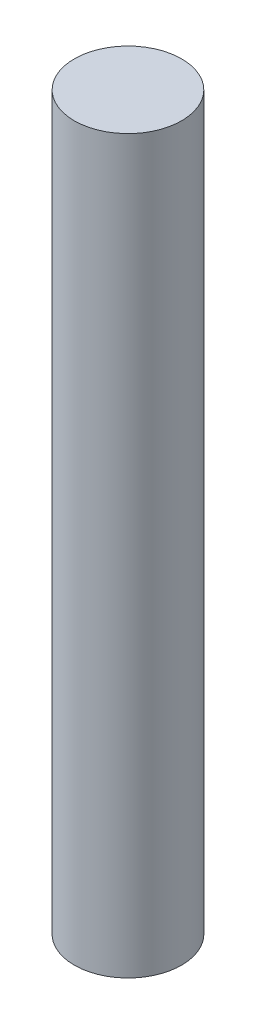
ISO-10303-21;
HEADER;
FILE_DESCRIPTION(('STEP AP214'),'2;1');
FILE_NAME('part.step','',(''),(''),'','','');
FILE_SCHEMA(('AUTOMOTIVE_DESIGN { 1 0 10303 214 1 1 1 1 }'));
ENDSEC;
DATA;
#1=APPLICATION_CONTEXT('core data for automotive mechanical design processes');
#2=APPLICATION_PROTOCOL_DEFINITION('international standard','automotive_design',2000,#1);
#3=PRODUCT_CONTEXT('',#1,'mechanical');
#4=PRODUCT('Part','Part','',(#3));
#5=PRODUCT_RELATED_PRODUCT_CATEGORY('part','',(#4));
#6=PRODUCT_DEFINITION_FORMATION('','',#4);
#7=PRODUCT_DEFINITION_CONTEXT('part definition',#1,'design');
#8=PRODUCT_DEFINITION('design','',#6,#7);
#9=PRODUCT_DEFINITION_SHAPE('','',#8);
#10=(LENGTH_UNIT() NAMED_UNIT(*) SI_UNIT(.MILLI.,.METRE.));
#11=(NAMED_UNIT(*) PLANE_ANGLE_UNIT() SI_UNIT($,.RADIAN.));
#12=(NAMED_UNIT(*) SI_UNIT($,.STERADIAN.) SOLID_ANGLE_UNIT());
#13=UNCERTAINTY_MEASURE_WITH_UNIT(LENGTH_MEASURE(1.E-05),#10,'distance_accuracy_value','');
#14=(GEOMETRIC_REPRESENTATION_CONTEXT(3) GLOBAL_UNCERTAINTY_ASSIGNED_CONTEXT((#13)) GLOBAL_UNIT_ASSIGNED_CONTEXT((#10,
#11,#12)) REPRESENTATION_CONTEXT('',''));
#15=CARTESIAN_POINT('',(0.,0.,0.));
#16=DIRECTION('',(0.,0.,1.));
#17=DIRECTION('',(1.,0.,0.));
#18=AXIS2_PLACEMENT_3D('',#15,#16,#17);
#19=CARTESIAN_POINT('',(0.,477.,0.));
#20=DIRECTION('',(0.,-1.,0.));
#21=DIRECTION('',(0.,0.,-1.));
#22=AXIS2_PLACEMENT_3D('',#19,#20,#21);
#23=CYLINDRICAL_SURFACE('',#22,35.);
#24=CARTESIAN_POINT('',(0.,477.,0.));
#25=DIRECTION('',(0.,1.,0.));
#26=DIRECTION('',(0.,0.,1.));
#27=AXIS2_PLACEMENT_3D('',#24,#25,#26);
#28=CIRCLE('',#27,35.);
#29=CARTESIAN_POINT('',(0.,477.,35.));
#30=VERTEX_POINT('',#29);
#31=EDGE_CURVE('E10',#30,#30,#28,.T.);
#32=ORIENTED_EDGE('',*,*,#31,.F.);
#33=EDGE_LOOP('',(#32));
#34=FACE_BOUND('',#33,.T.);
#35=CARTESIAN_POINT('',(0.,0.,0.));
#36=DIRECTION('',(0.,1.,0.));
#37=DIRECTION('',(0.,0.,1.));
#38=AXIS2_PLACEMENT_3D('',#35,#36,#37);
#39=CIRCLE('',#38,35.);
#40=CARTESIAN_POINT('',(0.,0.,35.));
#41=VERTEX_POINT('',#40);
#42=EDGE_CURVE('E40',#41,#41,#39,.T.);
#43=ORIENTED_EDGE('',*,*,#42,.T.);
#44=EDGE_LOOP('',(#43));
#45=FACE_BOUND('',#44,.T.);
#46=ADVANCED_FACE('F37',(#34,#45),#23,.T.);
#47=CARTESIAN_POINT('',(0.,477.,0.));
#48=DIRECTION('',(0.,1.,0.));
#49=DIRECTION('',(0.,0.,1.));
#50=AXIS2_PLACEMENT_3D('',#47,#48,#49);
#51=PLANE('',#50);
#52=ORIENTED_EDGE('',*,*,#31,.T.);
#53=EDGE_LOOP('',(#52));
#54=FACE_BOUND('',#53,.T.);
#55=ADVANCED_FACE('F52',(#54),#51,.T.);
#56=CARTESIAN_POINT('',(0.,0.,0.));
#57=DIRECTION('',(0.,1.,0.));
#58=DIRECTION('',(0.,0.,1.));
#59=AXIS2_PLACEMENT_3D('',#56,#57,#58);
#60=PLANE('',#59);
#61=ORIENTED_EDGE('',*,*,#42,.F.);
#62=EDGE_LOOP('',(#61));
#63=FACE_BOUND('',#62,.T.);
#64=ADVANCED_FACE('F50',(#63),#60,.F.);
#65=CLOSED_SHELL('',(#46,#55,#64));
#66=MANIFOLD_SOLID_BREP('B2',#65);
#67=ADVANCED_BREP_SHAPE_REPRESENTATION('',(#18,#66),#14);
#68=SHAPE_DEFINITION_REPRESENTATION(#9,#67);
ENDSEC;
END-ISO-10303-21;
